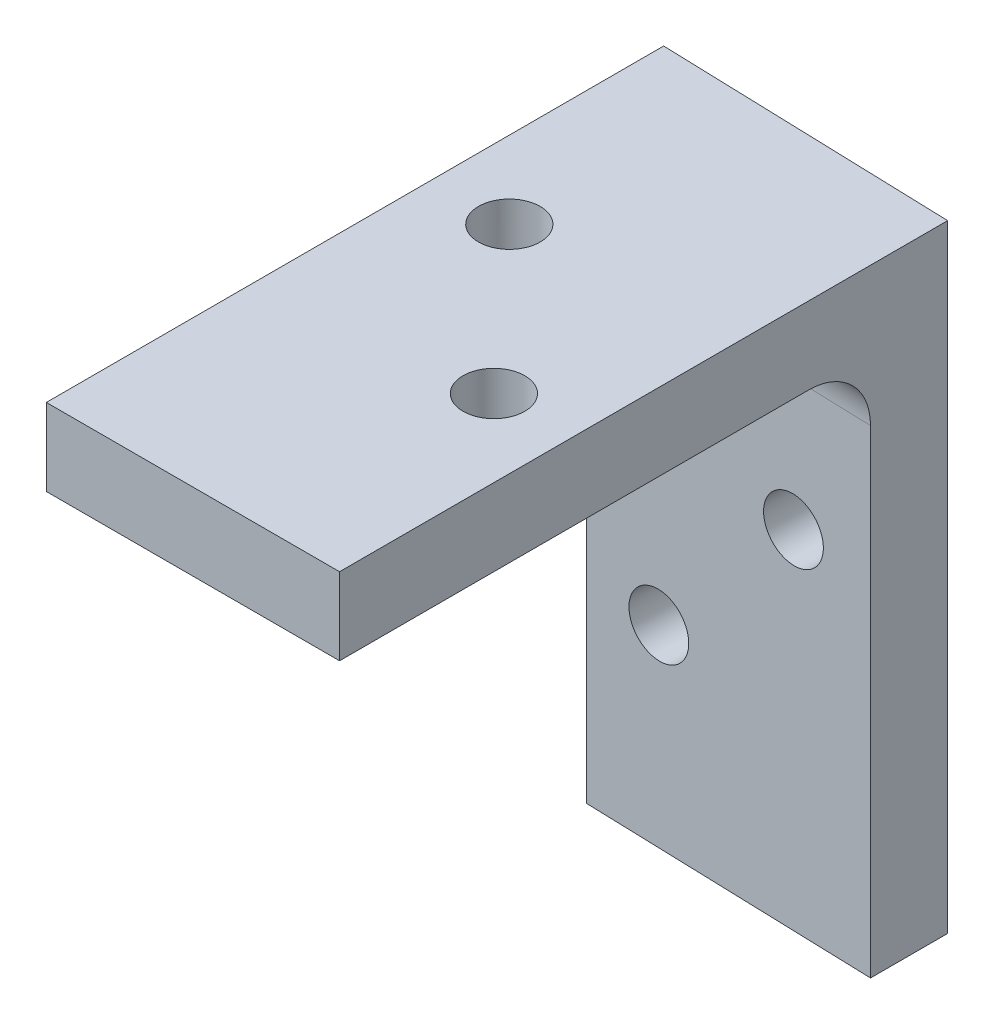
ISO-10303-21;
HEADER;
FILE_DESCRIPTION(('STEP AP214'),'2;1');
FILE_NAME('part.step','',(''),(''),'','','');
FILE_SCHEMA(('AUTOMOTIVE_DESIGN { 1 0 10303 214 1 1 1 1 }'));
ENDSEC;
DATA;
#1=APPLICATION_CONTEXT('core data for automotive mechanical design processes');
#2=APPLICATION_PROTOCOL_DEFINITION('international standard','automotive_design',2000,#1);
#3=PRODUCT_CONTEXT('',#1,'mechanical');
#4=PRODUCT('Part','Part','',(#3));
#5=PRODUCT_RELATED_PRODUCT_CATEGORY('part','',(#4));
#6=PRODUCT_DEFINITION_FORMATION('','',#4);
#7=PRODUCT_DEFINITION_CONTEXT('part definition',#1,'design');
#8=PRODUCT_DEFINITION('design','',#6,#7);
#9=PRODUCT_DEFINITION_SHAPE('','',#8);
#10=(LENGTH_UNIT() NAMED_UNIT(*) SI_UNIT(.MILLI.,.METRE.));
#11=(NAMED_UNIT(*) PLANE_ANGLE_UNIT() SI_UNIT($,.RADIAN.));
#12=(NAMED_UNIT(*) SI_UNIT($,.STERADIAN.) SOLID_ANGLE_UNIT());
#13=UNCERTAINTY_MEASURE_WITH_UNIT(LENGTH_MEASURE(1.E-05),#10,'distance_accuracy_value','');
#14=(GEOMETRIC_REPRESENTATION_CONTEXT(3) GLOBAL_UNCERTAINTY_ASSIGNED_CONTEXT((#13)) GLOBAL_UNIT_ASSIGNED_CONTEXT((#10,
#11,#12)) REPRESENTATION_CONTEXT('',''));
#15=CARTESIAN_POINT('',(0.,0.,0.));
#16=DIRECTION('',(0.,0.,1.));
#17=DIRECTION('',(1.,0.,0.));
#18=AXIS2_PLACEMENT_3D('',#15,#16,#17);
#19=CARTESIAN_POINT('',(9.5,5.,20.));
#20=DIRECTION('',(-1.,0.,0.));
#21=DIRECTION('',(0.,0.,1.));
#22=AXIS2_PLACEMENT_3D('',#19,#20,#21);
#23=PLANE('',#22);
#24=DIRECTION('',(0.,0.,-1.));
#25=VECTOR('',#24,1.);
#26=CARTESIAN_POINT('',(9.5,0.,20.));
#27=LINE('',#26,#25);
#28=CARTESIAN_POINT('',(9.5,0.,20.));
#29=VERTEX_POINT('',#28);
#30=CARTESIAN_POINT('',(9.5,0.,-10.4009262122279));
#31=VERTEX_POINT('',#30);
#32=EDGE_CURVE('E140',#29,#31,#27,.T.);
#33=ORIENTED_EDGE('',*,*,#32,.T.);
#34=CARTESIAN_POINT('',(9.5,-4.,-10.4009262122279));
#35=DIRECTION('',(-1.,0.,0.));
#36=DIRECTION('',(0.,0.,-1.));
#37=AXIS2_PLACEMENT_3D('',#34,#35,#36);
#38=ELLIPSE('',#37,4.00197473294858,4.);
#39=CARTESIAN_POINT('',(9.5,-4.,-14.4029009451765));
#40=VERTEX_POINT('',#39);
#41=EDGE_CURVE('E11',#31,#40,#38,.T.);
#42=ORIENTED_EDGE('',*,*,#41,.T.);
#43=DIRECTION('',(0.,1.,0.));
#44=VECTOR('',#43,1.);
#45=CARTESIAN_POINT('',(9.5,-35.,-14.4029009451765));
#46=LINE('',#45,#44);
#47=CARTESIAN_POINT('',(9.5,-35.,-14.4029009451765));
#48=VERTEX_POINT('',#47);
#49=EDGE_CURVE('E107',#48,#40,#46,.T.);
#50=ORIENTED_EDGE('',*,*,#49,.F.);
#51=DIRECTION('',(0.,0.,1.));
#52=VECTOR('',#51,1.);
#53=CARTESIAN_POINT('',(9.5,-35.,-14.4029009451765));
#54=LINE('',#53,#52);
#55=CARTESIAN_POINT('',(9.5,-35.,-19.4029009451765));
#56=VERTEX_POINT('',#55);
#57=EDGE_CURVE('E115',#56,#48,#54,.T.);
#58=ORIENTED_EDGE('',*,*,#57,.F.);
#59=DIRECTION('',(0.,1.,0.));
#60=VECTOR('',#59,1.);
#61=CARTESIAN_POINT('',(9.5,0.,-19.4029009451765));
#62=LINE('',#61,#60);
#63=CARTESIAN_POINT('',(9.5,5.,-19.4029009451765));
#64=VERTEX_POINT('',#63);
#65=EDGE_CURVE('E133',#56,#64,#62,.T.);
#66=ORIENTED_EDGE('',*,*,#65,.T.);
#67=DIRECTION('',(0.,0.,-1.));
#68=VECTOR('',#67,1.);
#69=CARTESIAN_POINT('',(9.5,5.,20.));
#70=LINE('',#69,#68);
#71=CARTESIAN_POINT('',(9.5,5.,20.));
#72=VERTEX_POINT('',#71);
#73=EDGE_CURVE('E141',#72,#64,#70,.T.);
#74=ORIENTED_EDGE('',*,*,#73,.F.);
#75=DIRECTION('',(0.,-1.,0.));
#76=VECTOR('',#75,1.);
#77=CARTESIAN_POINT('',(9.5,5.,20.));
#78=LINE('',#77,#76);
#79=EDGE_CURVE('E152',#72,#29,#78,.T.);
#80=ORIENTED_EDGE('',*,*,#79,.T.);
#81=EDGE_LOOP('',(#33,#42,#50,#58,#66,#74,#80));
#82=FACE_BOUND('',#81,.T.);
#83=ADVANCED_FACE('F43',(#82),#23,.F.);
#84=CARTESIAN_POINT('',(-9.5,5.,20.));
#85=DIRECTION('',(1.,0.,0.));
#86=DIRECTION('',(0.,0.,-1.));
#87=AXIS2_PLACEMENT_3D('',#84,#85,#86);
#88=PLANE('',#87);
#89=DIRECTION('',(0.,-1.,0.));
#90=VECTOR('',#89,1.);
#91=CARTESIAN_POINT('',(-9.5,5.,-20.));
#92=LINE('',#91,#90);
#93=CARTESIAN_POINT('',(-9.5,5.,-20.));
#94=VERTEX_POINT('',#93);
#95=CARTESIAN_POINT('',(-9.5,-35.,-20.));
#96=VERTEX_POINT('',#95);
#97=EDGE_CURVE('E167',#94,#96,#92,.T.);
#98=ORIENTED_EDGE('',*,*,#97,.T.);
#99=DIRECTION('',(0.,0.,-1.));
#100=VECTOR('',#99,1.);
#101=CARTESIAN_POINT('',(-9.5,-35.,-20.));
#102=LINE('',#101,#100);
#103=CARTESIAN_POINT('',(-9.5,-35.,-15.));
#104=VERTEX_POINT('',#103);
#105=EDGE_CURVE('E114',#104,#96,#102,.T.);
#106=ORIENTED_EDGE('',*,*,#105,.F.);
#107=DIRECTION('',(0.,1.,0.));
#108=VECTOR('',#107,1.);
#109=CARTESIAN_POINT('',(-9.5,-35.,-15.));
#110=LINE('',#109,#108);
#111=CARTESIAN_POINT('',(-9.5,-4.,-15.));
#112=VERTEX_POINT('',#111);
#113=EDGE_CURVE('E109',#104,#112,#110,.T.);
#114=ORIENTED_EDGE('',*,*,#113,.T.);
#115=CARTESIAN_POINT('',(-9.5,-4.,-10.9980252670514));
#116=DIRECTION('',(1.,0.,0.));
#117=DIRECTION('',(0.,0.,-1.));
#118=AXIS2_PLACEMENT_3D('',#115,#116,#117);
#119=ELLIPSE('',#118,4.00197473294858,4.);
#120=CARTESIAN_POINT('',(-9.5,0.,-10.9980252670514));
#121=VERTEX_POINT('',#120);
#122=EDGE_CURVE('E52',#112,#121,#119,.T.);
#123=ORIENTED_EDGE('',*,*,#122,.T.);
#124=DIRECTION('',(0.,0.,1.));
#125=VECTOR('',#124,1.);
#126=CARTESIAN_POINT('',(-9.5,0.,20.));
#127=LINE('',#126,#125);
#128=CARTESIAN_POINT('',(-9.5,0.,20.));
#129=VERTEX_POINT('',#128);
#130=EDGE_CURVE('E155',#121,#129,#127,.T.);
#131=ORIENTED_EDGE('',*,*,#130,.T.);
#132=DIRECTION('',(0.,-1.,0.));
#133=VECTOR('',#132,1.);
#134=CARTESIAN_POINT('',(-9.5,5.,20.));
#135=LINE('',#134,#133);
#136=CARTESIAN_POINT('',(-9.5,5.,20.));
#137=VERTEX_POINT('',#136);
#138=EDGE_CURVE('E163',#137,#129,#135,.T.);
#139=ORIENTED_EDGE('',*,*,#138,.F.);
#140=DIRECTION('',(0.,0.,1.));
#141=VECTOR('',#140,1.);
#142=CARTESIAN_POINT('',(-9.5,5.,20.));
#143=LINE('',#142,#141);
#144=EDGE_CURVE('E145',#94,#137,#143,.T.);
#145=ORIENTED_EDGE('',*,*,#144,.F.);
#146=EDGE_LOOP('',(#98,#106,#114,#123,#131,#139,#145));
#147=FACE_BOUND('',#146,.T.);
#148=ADVANCED_FACE('F194',(#147),#88,.F.);
#149=CARTESIAN_POINT('',(-9.5,5.,20.));
#150=DIRECTION('',(0.,0.,-1.));
#151=DIRECTION('',(-1.,0.,0.));
#152=AXIS2_PLACEMENT_3D('',#149,#150,#151);
#153=PLANE('',#152);
#154=DIRECTION('',(1.,0.,0.));
#155=VECTOR('',#154,1.);
#156=CARTESIAN_POINT('',(-9.5,0.,20.));
#157=LINE('',#156,#155);
#158=EDGE_CURVE('E146',#129,#29,#157,.T.);
#159=ORIENTED_EDGE('',*,*,#158,.T.);
#160=ORIENTED_EDGE('',*,*,#79,.F.);
#161=DIRECTION('',(1.,0.,0.));
#162=VECTOR('',#161,1.);
#163=CARTESIAN_POINT('',(-9.5,5.,20.));
#164=LINE('',#163,#162);
#165=EDGE_CURVE('E149',#137,#72,#164,.T.);
#166=ORIENTED_EDGE('',*,*,#165,.F.);
#167=ORIENTED_EDGE('',*,*,#138,.T.);
#168=EDGE_LOOP('',(#159,#160,#166,#167));
#169=FACE_BOUND('',#168,.T.);
#170=ADVANCED_FACE('F232',(#169),#153,.F.);
#171=CARTESIAN_POINT('',(0.,5.,0.));
#172=DIRECTION('',(0.,-1.,0.));
#173=DIRECTION('',(0.,0.,-1.));
#174=AXIS2_PLACEMENT_3D('',#171,#172,#173);
#175=PLANE('',#174);
#176=CARTESIAN_POINT('',(-4.5,5.,-5.));
#177=DIRECTION('',(0.,1.,0.));
#178=DIRECTION('',(0.,0.,1.));
#179=AXIS2_PLACEMENT_3D('',#176,#177,#178);
#180=CIRCLE('',#179,2.);
#181=CARTESIAN_POINT('',(-4.5,5.,-3.));
#182=VERTEX_POINT('',#181);
#183=EDGE_CURVE('E175',#182,#182,#180,.T.);
#184=ORIENTED_EDGE('',*,*,#183,.F.);
#185=EDGE_LOOP('',(#184));
#186=FACE_BOUND('',#185,.T.);
#187=CARTESIAN_POINT('',(4.5,5.,5.));
#188=DIRECTION('',(0.,1.,0.));
#189=DIRECTION('',(0.,0.,1.));
#190=AXIS2_PLACEMENT_3D('',#187,#188,#189);
#191=CIRCLE('',#190,2.);
#192=CARTESIAN_POINT('',(4.5,5.,7.));
#193=VERTEX_POINT('',#192);
#194=EDGE_CURVE('E188',#193,#193,#191,.T.);
#195=ORIENTED_EDGE('',*,*,#194,.F.);
#196=EDGE_LOOP('',(#195));
#197=FACE_BOUND('',#196,.T.);
#198=ORIENTED_EDGE('',*,*,#73,.T.);
#199=DIRECTION('',(0.999506560365732,0.,0.0314107590781213));
#200=VECTOR('',#199,1.);
#201=CARTESIAN_POINT('',(9.5,5.,-19.4029009451765));
#202=LINE('',#201,#200);
#203=EDGE_CURVE('E129',#94,#64,#202,.T.);
#204=ORIENTED_EDGE('',*,*,#203,.F.);
#205=ORIENTED_EDGE('',*,*,#144,.T.);
#206=ORIENTED_EDGE('',*,*,#165,.T.);
#207=EDGE_LOOP('',(#198,#204,#205,#206));
#208=FACE_BOUND('',#207,.T.);
#209=ADVANCED_FACE('F227',(#186,#197,#208),#175,.F.);
#210=CARTESIAN_POINT('',(0.,0.,0.));
#211=DIRECTION('',(0.,-1.,0.));
#212=DIRECTION('',(0.,0.,-1.));
#213=AXIS2_PLACEMENT_3D('',#210,#211,#212);
#214=PLANE('',#213);
#215=CARTESIAN_POINT('',(-4.5,0.,-5.));
#216=DIRECTION('',(0.,-1.,0.));
#217=DIRECTION('',(0.,0.,-1.));
#218=AXIS2_PLACEMENT_3D('',#215,#216,#217);
#219=CIRCLE('',#218,2.);
#220=CARTESIAN_POINT('',(-4.5,0.,-7.));
#221=VERTEX_POINT('',#220);
#222=EDGE_CURVE('E125',#221,#221,#219,.T.);
#223=ORIENTED_EDGE('',*,*,#222,.F.);
#224=EDGE_LOOP('',(#223));
#225=FACE_BOUND('',#224,.T.);
#226=CARTESIAN_POINT('',(4.5,0.,5.));
#227=DIRECTION('',(0.,-1.,0.));
#228=DIRECTION('',(0.,0.,-1.));
#229=AXIS2_PLACEMENT_3D('',#226,#227,#228);
#230=CIRCLE('',#229,2.);
#231=CARTESIAN_POINT('',(4.5,0.,3.));
#232=VERTEX_POINT('',#231);
#233=EDGE_CURVE('E171',#232,#232,#230,.T.);
#234=ORIENTED_EDGE('',*,*,#233,.F.);
#235=EDGE_LOOP('',(#234));
#236=FACE_BOUND('',#235,.T.);
#237=ORIENTED_EDGE('',*,*,#130,.F.);
#238=DIRECTION('',(-0.999506560365732,0.,-0.0314107590781211));
#239=VECTOR('',#238,1.);
#240=CARTESIAN_POINT('',(0.335912820191552,0.,-10.6889192539849));
#241=LINE('',#240,#239);
#242=EDGE_CURVE('E65',#121,#31,#241,.F.);
#243=ORIENTED_EDGE('',*,*,#242,.T.);
#244=ORIENTED_EDGE('',*,*,#32,.F.);
#245=ORIENTED_EDGE('',*,*,#158,.F.);
#246=EDGE_LOOP('',(#237,#243,#244,#245));
#247=FACE_BOUND('',#246,.T.);
#248=ADVANCED_FACE('F220',(#225,#236,#247),#214,.T.);
#249=CARTESIAN_POINT('',(9.5,0.,-19.4029009451765));
#250=DIRECTION('',(-0.0314107590781213,0.,0.999506560365732));
#251=DIRECTION('',(0.999506560365732,0.,0.0314107590781213));
#252=AXIS2_PLACEMENT_3D('',#249,#250,#251);
#253=PLANE('',#252);
#254=CARTESIAN_POINT('',(4.50246719817134,-12.5,-19.5599547405671));
#255=DIRECTION('',(0.0314107590781213,0.,-0.999506560365732));
#256=DIRECTION('',(-0.999506560365732,0.,-0.0314107590781213));
#257=AXIS2_PLACEMENT_3D('',#254,#255,#256);
#258=CIRCLE('',#257,2.);
#259=CARTESIAN_POINT('',(2.50345407743988,-12.5,-19.6227762587233));
#260=VERTEX_POINT('',#259);
#261=EDGE_CURVE('E184',#260,#260,#258,.T.);
#262=ORIENTED_EDGE('',*,*,#261,.F.);
#263=EDGE_LOOP('',(#262));
#264=FACE_BOUND('',#263,.T.);
#265=CARTESIAN_POINT('',(-4.50246719817134,-22.5,-19.8429462046094));
#266=DIRECTION('',(0.0314107590781213,0.,-0.999506560365732));
#267=DIRECTION('',(-0.999506560365732,0.,-0.0314107590781213));
#268=AXIS2_PLACEMENT_3D('',#265,#266,#267);
#269=CIRCLE('',#268,2.);
#270=CARTESIAN_POINT('',(-6.50148031890281,-22.5,-19.9057677227656));
#271=VERTEX_POINT('',#270);
#272=EDGE_CURVE('E206',#271,#271,#269,.T.);
#273=ORIENTED_EDGE('',*,*,#272,.F.);
#274=EDGE_LOOP('',(#273));
#275=FACE_BOUND('',#274,.T.);
#276=ORIENTED_EDGE('',*,*,#203,.T.);
#277=ORIENTED_EDGE('',*,*,#65,.F.);
#278=DIRECTION('',(0.999506560365732,0.,0.0314107590781213));
#279=VECTOR('',#278,1.);
#280=CARTESIAN_POINT('',(9.5,-35.,-19.4029009451765));
#281=LINE('',#280,#279);
#282=EDGE_CURVE('E121',#96,#56,#281,.T.);
#283=ORIENTED_EDGE('',*,*,#282,.F.);
#284=ORIENTED_EDGE('',*,*,#97,.F.);
#285=EDGE_LOOP('',(#276,#277,#283,#284));
#286=FACE_BOUND('',#285,.T.);
#287=ADVANCED_FACE('F217',(#264,#275,#286),#253,.F.);
#288=CARTESIAN_POINT('',(-9.5,-35.,-15.));
#289=DIRECTION('',(0.0314107590781211,0.,-0.999506560365732));
#290=DIRECTION('',(-0.999506560365732,0.,-0.0314107590781211));
#291=AXIS2_PLACEMENT_3D('',#288,#289,#290);
#292=PLANE('',#291);
#293=CARTESIAN_POINT('',(4.34549089934809,-12.5,-14.5648879194964));
#294=DIRECTION('',(0.0314107590781211,0.,-0.999506560365732));
#295=DIRECTION('',(-0.999506560365732,0.,-0.0314107590781211));
#296=AXIS2_PLACEMENT_3D('',#293,#294,#295);
#297=CIRCLE('',#296,2.);
#298=CARTESIAN_POINT('',(2.34647777861663,-12.5,-14.6277094376526));
#299=VERTEX_POINT('',#298);
#300=EDGE_CURVE('E183',#299,#299,#297,.T.);
#301=ORIENTED_EDGE('',*,*,#300,.T.);
#302=EDGE_LOOP('',(#301));
#303=FACE_BOUND('',#302,.T.);
#304=CARTESIAN_POINT('',(-4.65944349699459,-22.5,-14.8478793835387));
#305=DIRECTION('',(0.0314107590781211,0.,-0.999506560365732));
#306=DIRECTION('',(-0.999506560365732,0.,-0.0314107590781211));
#307=AXIS2_PLACEMENT_3D('',#304,#305,#306);
#308=CIRCLE('',#307,2.);
#309=CARTESIAN_POINT('',(-6.65845661772606,-22.5,-14.910700901695));
#310=VERTEX_POINT('',#309);
#311=EDGE_CURVE('E179',#310,#310,#308,.T.);
#312=ORIENTED_EDGE('',*,*,#311,.T.);
#313=EDGE_LOOP('',(#312));
#314=FACE_BOUND('',#313,.T.);
#315=ORIENTED_EDGE('',*,*,#49,.T.);
#316=DIRECTION('',(-0.999506560365732,0.,-0.0314107590781211));
#317=VECTOR('',#316,1.);
#318=CARTESIAN_POINT('',(-9.5,-4.,-15.));
#319=LINE('',#318,#317);
#320=EDGE_CURVE('E170',#40,#112,#319,.T.);
#321=ORIENTED_EDGE('',*,*,#320,.T.);
#322=ORIENTED_EDGE('',*,*,#113,.F.);
#323=DIRECTION('',(-0.999506560365732,0.,-0.0314107590781211));
#324=VECTOR('',#323,1.);
#325=CARTESIAN_POINT('',(-9.5,-35.,-15.));
#326=LINE('',#325,#324);
#327=EDGE_CURVE('E102',#48,#104,#326,.T.);
#328=ORIENTED_EDGE('',*,*,#327,.F.);
#329=EDGE_LOOP('',(#315,#321,#322,#328));
#330=FACE_BOUND('',#329,.T.);
#331=ADVANCED_FACE('F104',(#303,#314,#330),#292,.F.);
#332=CARTESIAN_POINT('',(0.,-35.,0.));
#333=DIRECTION('',(0.,1.,0.));
#334=DIRECTION('',(0.,0.,1.));
#335=AXIS2_PLACEMENT_3D('',#332,#333,#334);
#336=PLANE('',#335);
#337=ORIENTED_EDGE('',*,*,#57,.T.);
#338=ORIENTED_EDGE('',*,*,#327,.T.);
#339=ORIENTED_EDGE('',*,*,#105,.T.);
#340=ORIENTED_EDGE('',*,*,#282,.T.);
#341=EDGE_LOOP('',(#337,#338,#339,#340));
#342=FACE_BOUND('',#341,.T.);
#343=ADVANCED_FACE('F119',(#342),#336,.F.);
#344=CARTESIAN_POINT('',(4.5,-35.,5.));
#345=DIRECTION('',(0.,1.,0.));
#346=DIRECTION('',(0.,0.,1.));
#347=AXIS2_PLACEMENT_3D('',#344,#345,#346);
#348=CYLINDRICAL_SURFACE('',#347,2.);
#349=ORIENTED_EDGE('',*,*,#233,.T.);
#350=EDGE_LOOP('',(#349));
#351=FACE_BOUND('',#350,.T.);
#352=ORIENTED_EDGE('',*,*,#194,.T.);
#353=EDGE_LOOP('',(#352));
#354=FACE_BOUND('',#353,.T.);
#355=ADVANCED_FACE('F259',(#351,#354),#348,.F.);
#356=CARTESIAN_POINT('',(-4.5,-35.,-5.));
#357=DIRECTION('',(0.,1.,0.));
#358=DIRECTION('',(0.,0.,1.));
#359=AXIS2_PLACEMENT_3D('',#356,#357,#358);
#360=CYLINDRICAL_SURFACE('',#359,2.);
#361=ORIENTED_EDGE('',*,*,#222,.T.);
#362=EDGE_LOOP('',(#361));
#363=FACE_BOUND('',#362,.T.);
#364=ORIENTED_EDGE('',*,*,#183,.T.);
#365=EDGE_LOOP('',(#364));
#366=FACE_BOUND('',#365,.T.);
#367=ADVANCED_FACE('F262',(#363,#366),#360,.F.);
#368=CARTESIAN_POINT('',(-5.75827758875733,-22.5,20.1175883639561));
#369=DIRECTION('',(0.0314107590781213,0.,-0.999506560365732));
#370=DIRECTION('',(-0.999506560365732,0.,-0.0314107590781213));
#371=AXIS2_PLACEMENT_3D('',#368,#369,#370);
#372=CYLINDRICAL_SURFACE('',#371,2.);
#373=ORIENTED_EDGE('',*,*,#272,.T.);
#374=EDGE_LOOP('',(#373));
#375=FACE_BOUND('',#374,.T.);
#376=ORIENTED_EDGE('',*,*,#311,.F.);
#377=EDGE_LOOP('',(#376));
#378=FACE_BOUND('',#377,.T.);
#379=ADVANCED_FACE('F238',(#375,#378),#372,.F.);
#380=CARTESIAN_POINT('',(3.24665680758535,-12.5,20.4005798279984));
#381=DIRECTION('',(0.0314107590781213,0.,-0.999506560365732));
#382=DIRECTION('',(-0.999506560365732,0.,-0.0314107590781213));
#383=AXIS2_PLACEMENT_3D('',#380,#381,#382);
#384=CYLINDRICAL_SURFACE('',#383,2.);
#385=ORIENTED_EDGE('',*,*,#261,.T.);
#386=EDGE_LOOP('',(#385));
#387=FACE_BOUND('',#386,.T.);
#388=ORIENTED_EDGE('',*,*,#300,.F.);
#389=EDGE_LOOP('',(#388));
#390=FACE_BOUND('',#389,.T.);
#391=ADVANCED_FACE('F214',(#387,#390),#384,.F.);
#392=CARTESIAN_POINT('',(-9.62564303631248,-4.,-11.0019737585371));
#393=DIRECTION('',(-0.999506560365732,0.,-0.0314107590781211));
#394=DIRECTION('',(-0.0314107590781211,0.,0.999506560365732));
#395=AXIS2_PLACEMENT_3D('',#392,#393,#394);
#396=CYLINDRICAL_SURFACE('',#395,4.);
#397=ORIENTED_EDGE('',*,*,#41,.F.);
#398=ORIENTED_EDGE('',*,*,#242,.F.);
#399=ORIENTED_EDGE('',*,*,#122,.F.);
#400=ORIENTED_EDGE('',*,*,#320,.F.);
#401=EDGE_LOOP('',(#397,#398,#399,#400));
#402=FACE_BOUND('',#401,.T.);
#403=ADVANCED_FACE('F45',(#402),#396,.F.);
#404=CLOSED_SHELL('',(#83,#148,#170,#209,#248,#287,#331,#343,#355,#367,#379,#391,#403));
#405=MANIFOLD_SOLID_BREP('B2',#404);
#406=ADVANCED_BREP_SHAPE_REPRESENTATION('',(#18,#405),#14);
#407=SHAPE_DEFINITION_REPRESENTATION(#9,#406);
ENDSEC;
END-ISO-10303-21;
